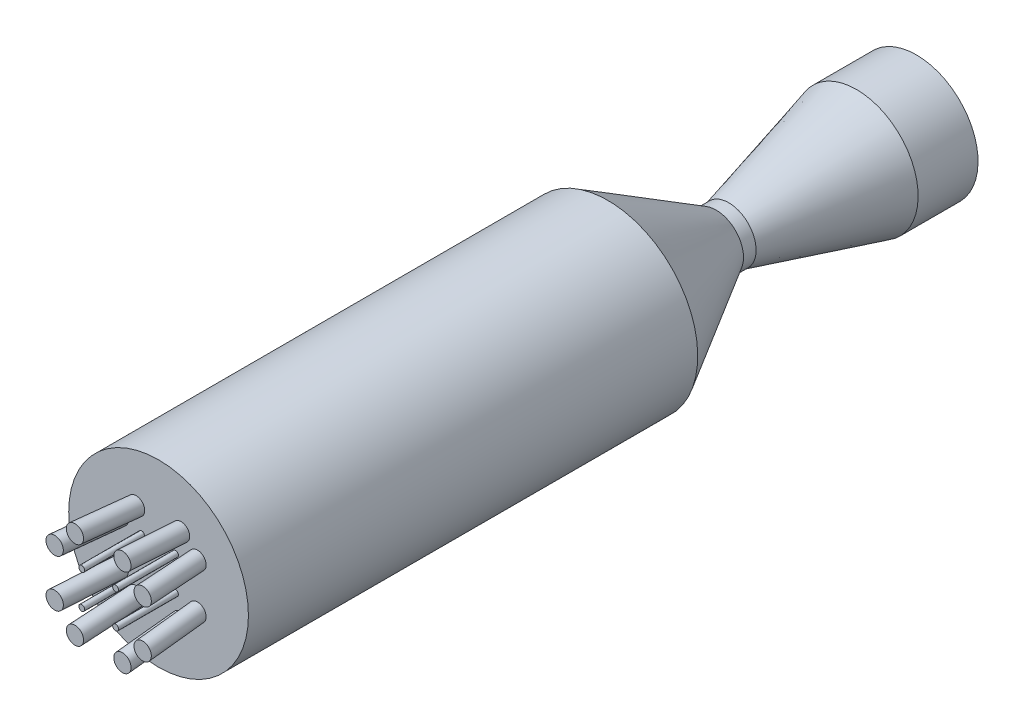
ISO-10303-21;
HEADER;
FILE_DESCRIPTION(('STEP AP214'),'2;1');
FILE_NAME('part.step','',(''),(''),'','','');
FILE_SCHEMA(('AUTOMOTIVE_DESIGN { 1 0 10303 214 1 1 1 1 }'));
ENDSEC;
DATA;
#1=APPLICATION_CONTEXT('core data for automotive mechanical design processes');
#2=APPLICATION_PROTOCOL_DEFINITION('international standard','automotive_design',2000,#1);
#3=PRODUCT_CONTEXT('',#1,'mechanical');
#4=PRODUCT('Part','Part','',(#3));
#5=PRODUCT_RELATED_PRODUCT_CATEGORY('part','',(#4));
#6=PRODUCT_DEFINITION_FORMATION('','',#4);
#7=PRODUCT_DEFINITION_CONTEXT('part definition',#1,'design');
#8=PRODUCT_DEFINITION('design','',#6,#7);
#9=PRODUCT_DEFINITION_SHAPE('','',#8);
#10=(LENGTH_UNIT() NAMED_UNIT(*) SI_UNIT(.MILLI.,.METRE.));
#11=(NAMED_UNIT(*) PLANE_ANGLE_UNIT() SI_UNIT($,.RADIAN.));
#12=(NAMED_UNIT(*) SI_UNIT($,.STERADIAN.) SOLID_ANGLE_UNIT());
#13=UNCERTAINTY_MEASURE_WITH_UNIT(LENGTH_MEASURE(1.E-05),#10,'distance_accuracy_value','');
#14=(GEOMETRIC_REPRESENTATION_CONTEXT(3) GLOBAL_UNCERTAINTY_ASSIGNED_CONTEXT((#13)) GLOBAL_UNIT_ASSIGNED_CONTEXT((#10,
#11,#12)) REPRESENTATION_CONTEXT('',''));
#15=CARTESIAN_POINT('',(0.,0.,0.));
#16=DIRECTION('',(0.,0.,1.));
#17=DIRECTION('',(1.,0.,0.));
#18=AXIS2_PLACEMENT_3D('',#15,#16,#17);
#19=CARTESIAN_POINT('',(0.,0.,-62.6713296347436));
#20=DIRECTION('',(0.,0.,-1.));
#21=DIRECTION('',(0.,1.,0.));
#22=AXIS2_PLACEMENT_3D('',#19,#20,#21);
#23=CONICAL_SURFACE('',#22,4.57,0.261799387799147);
#24=CARTESIAN_POINT('',(0.,0.,-84.));
#25=DIRECTION('',(0.,0.,-1.));
#26=DIRECTION('',(0.,1.,0.));
#27=AXIS2_PLACEMENT_3D('',#24,#25,#26);
#28=CIRCLE('',#27,10.285);
#29=CARTESIAN_POINT('',(0.,10.285,-84.));
#30=VERTEX_POINT('',#29);
#31=EDGE_CURVE('E10',#30,#30,#28,.T.);
#32=ORIENTED_EDGE('',*,*,#31,.F.);
#33=EDGE_LOOP('',(#32));
#34=FACE_BOUND('',#33,.T.);
#35=CARTESIAN_POINT('',(0.,0.,-62.6713296347436));
#36=DIRECTION('',(0.,0.,-1.));
#37=DIRECTION('',(0.,1.,0.));
#38=AXIS2_PLACEMENT_3D('',#35,#36,#37);
#39=CIRCLE('',#38,4.57);
#40=CARTESIAN_POINT('',(0.,4.57,-62.6713296347436));
#41=VERTEX_POINT('',#40);
#42=EDGE_CURVE('E51',#41,#41,#39,.T.);
#43=ORIENTED_EDGE('',*,*,#42,.T.);
#44=EDGE_LOOP('',(#43));
#45=FACE_BOUND('',#44,.T.);
#46=ADVANCED_FACE('F43',(#34,#45),#23,.T.);
#47=CARTESIAN_POINT('',(0.,0.,-62.6713296347436));
#48=DIRECTION('',(0.,0.,-1.));
#49=DIRECTION('',(0.,1.,0.));
#50=AXIS2_PLACEMENT_3D('',#47,#48,#49);
#51=CYLINDRICAL_SURFACE('',#50,4.57);
#52=ORIENTED_EDGE('',*,*,#42,.F.);
#53=EDGE_LOOP('',(#52));
#54=FACE_BOUND('',#53,.T.);
#55=CARTESIAN_POINT('',(0.,0.,-60.5652899229432));
#56=DIRECTION('',(0.,0.,-1.));
#57=DIRECTION('',(0.,1.,0.));
#58=AXIS2_PLACEMENT_3D('',#55,#56,#57);
#59=CIRCLE('',#58,4.57);
#60=CARTESIAN_POINT('',(0.,-4.57,-60.5652899229432));
#61=VERTEX_POINT('',#60);
#62=EDGE_CURVE('E56',#61,#61,#59,.T.);
#63=ORIENTED_EDGE('',*,*,#62,.T.);
#64=EDGE_LOOP('',(#63));
#65=FACE_BOUND('',#64,.T.);
#66=ADVANCED_FACE('F187',(#54,#65),#51,.T.);
#67=CARTESIAN_POINT('',(0.,0.,-42.5));
#68=DIRECTION('',(0.,0.,1.));
#69=DIRECTION('',(0.,-1.,0.));
#70=AXIS2_PLACEMENT_3D('',#67,#68,#69);
#71=CONICAL_SURFACE('',#70,15.,0.523598775598304);
#72=CARTESIAN_POINT('',(0.,0.,-42.5));
#73=DIRECTION('',(0.,0.,-1.));
#74=DIRECTION('',(0.,1.,0.));
#75=AXIS2_PLACEMENT_3D('',#72,#73,#74);
#76=CIRCLE('',#75,15.);
#77=CARTESIAN_POINT('',(0.,-15.,-42.5));
#78=VERTEX_POINT('',#77);
#79=EDGE_CURVE('E61',#78,#78,#76,.T.);
#80=CARTESIAN_POINT('',(0.,-4.57,-60.5652899229432));
#81=CARTESIAN_POINT('',(0.,-4.67864583333333,-60.3771098195792));
#82=CARTESIAN_POINT('',(0.,-4.78729166666667,-60.1889297162152));
#83=CARTESIAN_POINT('',(0.,-5.00458333333334,-59.8125695094872));
#84=CARTESIAN_POINT('',(0.,-5.11322916666667,-59.6243894061232));
#85=CARTESIAN_POINT('',(0.,-5.33052083333333,-59.2480291993952));
#86=CARTESIAN_POINT('',(0.,-5.43916666666667,-59.0598490960313));
#87=CARTESIAN_POINT('',(0.,-5.65645833333333,-58.6834888893033));
#88=CARTESIAN_POINT('',(0.,-5.76510416666667,-58.4953087859393));
#89=CARTESIAN_POINT('',(0.,-5.98239583333333,-58.1189485792113));
#90=CARTESIAN_POINT('',(0.,-6.09104166666667,-57.9307684758473));
#91=CARTESIAN_POINT('',(0.,-6.30833333333333,-57.5544082691193));
#92=CARTESIAN_POINT('',(0.,-6.41697916666667,-57.3662281657553));
#93=CARTESIAN_POINT('',(0.,-6.63427083333333,-56.9898679590273));
#94=CARTESIAN_POINT('',(0.,-6.74291666666667,-56.8016878556634));
#95=CARTESIAN_POINT('',(0.,-6.96020833333333,-56.4253276489354));
#96=CARTESIAN_POINT('',(0.,-7.06885416666667,-56.2371475455714));
#97=CARTESIAN_POINT('',(0.,-7.28614583333333,-55.8607873388434));
#98=CARTESIAN_POINT('',(0.,-7.39479166666667,-55.6726072354794));
#99=CARTESIAN_POINT('',(0.,-7.61208333333333,-55.2962470287514));
#100=CARTESIAN_POINT('',(0.,-7.72072916666667,-55.1080669253874));
#101=CARTESIAN_POINT('',(0.,-7.93802083333333,-54.7317067186594));
#102=CARTESIAN_POINT('',(0.,-8.04666666666666,-54.5435266152955));
#103=CARTESIAN_POINT('',(0.,-8.26395833333333,-54.1671664085675));
#104=CARTESIAN_POINT('',(0.,-8.37260416666667,-53.9789863052035));
#105=CARTESIAN_POINT('',(0.,-8.58989583333333,-53.6026260984755));
#106=CARTESIAN_POINT('',(0.,-8.69854166666667,-53.4144459951115));
#107=CARTESIAN_POINT('',(0.,-8.91583333333333,-53.0380857883835));
#108=CARTESIAN_POINT('',(0.,-9.02447916666667,-52.8499056850195));
#109=CARTESIAN_POINT('',(0.,-9.24177083333333,-52.4735454782915));
#110=CARTESIAN_POINT('',(0.,-9.35041666666667,-52.2853653749276));
#111=CARTESIAN_POINT('',(0.,-9.56770833333333,-51.9090051681996));
#112=CARTESIAN_POINT('',(0.,-9.67635416666666,-51.7208250648356));
#113=CARTESIAN_POINT('',(0.,-9.89364583333333,-51.3444648581076));
#114=CARTESIAN_POINT('',(0.,-10.0022916666667,-51.1562847547436));
#115=CARTESIAN_POINT('',(0.,-10.2195833333333,-50.7799245480156));
#116=CARTESIAN_POINT('',(0.,-10.3282291666667,-50.5917444446516));
#117=CARTESIAN_POINT('',(0.,-10.5455208333333,-50.2153842379237));
#118=CARTESIAN_POINT('',(0.,-10.6541666666667,-50.0272041345597));
#119=CARTESIAN_POINT('',(0.,-10.8714583333333,-49.6508439278317));
#120=CARTESIAN_POINT('',(0.,-10.9801041666667,-49.4626638244677));
#121=CARTESIAN_POINT('',(0.,-11.1973958333333,-49.0863036177397));
#122=CARTESIAN_POINT('',(0.,-11.3060416666667,-48.8981235143757));
#123=CARTESIAN_POINT('',(0.,-11.5233333333333,-48.5217633076477));
#124=CARTESIAN_POINT('',(0.,-11.6319791666667,-48.3335832042837));
#125=CARTESIAN_POINT('',(0.,-11.8492708333333,-47.9572229975558));
#126=CARTESIAN_POINT('',(0.,-11.9579166666667,-47.7690428941918));
#127=CARTESIAN_POINT('',(0.,-12.1752083333333,-47.3926826874638));
#128=CARTESIAN_POINT('',(0.,-12.2838541666667,-47.2045025840998));
#129=CARTESIAN_POINT('',(0.,-12.5011458333333,-46.8281423773718));
#130=CARTESIAN_POINT('',(0.,-12.6097916666667,-46.6399622740078));
#131=CARTESIAN_POINT('',(0.,-12.8270833333333,-46.2636020672798));
#132=CARTESIAN_POINT('',(0.,-12.9357291666667,-46.0754219639158));
#133=CARTESIAN_POINT('',(0.,-13.1530208333333,-45.6990617571879));
#134=CARTESIAN_POINT('',(0.,-13.2616666666667,-45.5108816538239));
#135=CARTESIAN_POINT('',(0.,-13.4789583333333,-45.1345214470959));
#136=CARTESIAN_POINT('',(0.,-13.5876041666667,-44.9463413437319));
#137=CARTESIAN_POINT('',(0.,-13.8048958333333,-44.5699811370039));
#138=CARTESIAN_POINT('',(0.,-13.9135416666667,-44.3818010336399));
#139=CARTESIAN_POINT('',(0.,-14.1308333333333,-44.0054408269119));
#140=CARTESIAN_POINT('',(0.,-14.2394791666667,-43.8172607235479));
#141=CARTESIAN_POINT('',(0.,-14.4567708333333,-43.44090051682));
#142=CARTESIAN_POINT('',(0.,-14.5654166666667,-43.252720413456));
#143=CARTESIAN_POINT('',(0.,-14.7827083333333,-42.876360206728));
#144=CARTESIAN_POINT('',(0.,-14.8913541666667,-42.688180103364));
#145=CARTESIAN_POINT('',(0.,-15.,-42.5));
#146=B_SPLINE_CURVE_WITH_KNOTS('',3,(#80,#81,#82,#83,#84,#85,#86,#87,#88,#89,#90,#91,#92,#93,
#94,#95,#96,#97,#98,#99,#100,#101,#102,#103,#104,#105,#106,#107,#108,#109,#110,#111,#112,#113,
#114,#115,#116,#117,#118,#119,#120,#121,#122,#123,#124,#125,#126,#127,#128,#129,#130,#131,#132,
#133,#134,#135,#136,#137,#138,#139,#140,#141,#142,#143,#144,#145),.UNSPECIFIED.,.F.,.F.,(4,2,2,
2,2,2,2,2,2,2,2,2,2,2,2,2,2,2,2,2,2,2,2,2,2,2,2,2,2,2,2,2,4),(0.,0.651874999999996,
1.30374999999999,1.95562499999999,2.60749999999997,3.25937499999998,3.91124999999997,
4.56312499999996,5.21499999999995,5.86687499999995,6.51874999999994,7.17062499999994,
7.82249999999994,8.47437499999992,9.12624999999992,9.77812499999991,10.4299999999999,
11.0818749999999,11.7337499999999,12.3856249999999,13.0374999999999,13.6893749999999,
14.3412499999999,14.9931249999999,15.6449999999999,16.2968749999999,16.9487499999999,
17.6006249999999,18.2524999999998,18.9043749999998,19.5562499999998,20.2081249999998,
20.8599999999998),.UNSPECIFIED.);
#147=EDGE_CURVE('BSEAM192',#61,#78,#146,.T.);
#148=ORIENTED_EDGE('',*,*,#62,.F.);
#149=ORIENTED_EDGE('',*,*,#79,.T.);
#150=ORIENTED_EDGE('',*,*,#147,.T.);
#151=ORIENTED_EDGE('',*,*,#147,.F.);
#152=EDGE_LOOP('',(#148,#150,#149,#151));
#153=FACE_BOUND('',#152,.T.);
#154=ADVANCED_FACE('F192',(#153),#71,.T.);
#155=CARTESIAN_POINT('',(0.,0.,42.5));
#156=DIRECTION('',(0.,0.,-1.));
#157=DIRECTION('',(-1.,0.,0.));
#158=AXIS2_PLACEMENT_3D('',#155,#156,#157);
#159=CYLINDRICAL_SURFACE('',#158,15.);
#160=ORIENTED_EDGE('',*,*,#79,.F.);
#161=EDGE_LOOP('',(#160));
#162=FACE_BOUND('',#161,.T.);
#163=CARTESIAN_POINT('',(0.,0.,32.5));
#164=DIRECTION('',(0.,0.,1.));
#165=DIRECTION('',(1.,0.,0.));
#166=AXIS2_PLACEMENT_3D('',#163,#164,#165);
#167=CIRCLE('',#166,15.);
#168=CARTESIAN_POINT('',(15.,0.,32.5));
#169=VERTEX_POINT('',#168);
#170=EDGE_CURVE('E67',#169,#169,#167,.T.);
#171=ORIENTED_EDGE('',*,*,#170,.F.);
#172=EDGE_LOOP('',(#171));
#173=FACE_BOUND('',#172,.T.);
#174=ADVANCED_FACE('F198',(#162,#173),#159,.T.);
#175=CARTESIAN_POINT('',(-7.41821043677447,-3.98198390985581,43.3782773972939));
#176=DIRECTION('',(0.0845269435031215,0.0212442772509707,-0.996194698091745));
#177=DIRECTION('',(-0.996419575167966,0.,-0.084546024283167));
#178=AXIS2_PLACEMENT_3D('',#175,#176,#177);
#179=CYLINDRICAL_SURFACE('',#178,1.44135);
#180=CARTESIAN_POINT('',(-7.34368875533675,-3.96325426938783,42.5));
#181=DIRECTION('',(0.,0.,1.));
#182=DIRECTION('',(0.96983791128775,0.243750745289145,0.));
#183=AXIS2_PLACEMENT_3D('',#180,#181,#182);
#184=ELLIPSE('',#183,1.4468557228431,1.44135);
#185=CARTESIAN_POINT('',(-5.94047322315987,-3.61058210861895,42.5));
#186=VERTEX_POINT('',#185);
#187=EDGE_CURVE('E72',#186,#186,#184,.F.);
#188=ORIENTED_EDGE('',*,*,#187,.T.);
#189=EDGE_LOOP('',(#188));
#190=FACE_BOUND('',#189,.T.);
#191=CARTESIAN_POINT('',(-6.49519052838336,-3.74999999999987,32.5));
#192=DIRECTION('',(0.,0.,1.));
#193=DIRECTION('',(0.96983791128775,0.243750745289145,0.));
#194=AXIS2_PLACEMENT_3D('',#191,#192,#193);
#195=ELLIPSE('',#194,1.4468557228431,1.44135);
#196=CARTESIAN_POINT('',(-5.09197499620648,-3.397327839231,32.5));
#197=VERTEX_POINT('',#196);
#198=EDGE_CURVE('E68',#197,#197,#195,.F.);
#199=ORIENTED_EDGE('',*,*,#198,.F.);
#200=EDGE_LOOP('',(#199));
#201=FACE_BOUND('',#200,.T.);
#202=ADVANCED_FACE('F248',(#190,#201),#179,.T.);
#203=CARTESIAN_POINT('',(3.98198390985589,-7.41821043677443,43.3782773972939));
#204=DIRECTION('',(-0.0212442772509716,0.0845269435031213,-0.996194698091746));
#205=DIRECTION('',(0.,0.996419575167966,0.0845460242831668));
#206=AXIS2_PLACEMENT_3D('',#203,#204,#205);
#207=CYLINDRICAL_SURFACE('',#206,1.44135);
#208=CARTESIAN_POINT('',(3.9632542693879,-7.34368875533671,42.5));
#209=DIRECTION('',(0.,0.,1.));
#210=DIRECTION('',(-0.243750745289155,0.969837911287748,0.));
#211=AXIS2_PLACEMENT_3D('',#208,#209,#210);
#212=ELLIPSE('',#211,1.4468557228431,1.44135);
#213=CARTESIAN_POINT('',(3.61058210861902,-5.94047322315983,42.5));
#214=VERTEX_POINT('',#213);
#215=EDGE_CURVE('E78',#214,#214,#212,.F.);
#216=ORIENTED_EDGE('',*,*,#215,.T.);
#217=EDGE_LOOP('',(#216));
#218=FACE_BOUND('',#217,.T.);
#219=CARTESIAN_POINT('',(3.74999999999994,-6.49519052838332,32.5));
#220=DIRECTION('',(0.,0.,1.));
#221=DIRECTION('',(-0.243750745289155,0.969837911287748,0.));
#222=AXIS2_PLACEMENT_3D('',#219,#220,#221);
#223=ELLIPSE('',#222,1.4468557228431,1.44135);
#224=CARTESIAN_POINT('',(3.39732783923106,-5.09197499620644,32.5));
#225=VERTEX_POINT('',#224);
#226=EDGE_CURVE('E74',#225,#225,#223,.F.);
#227=ORIENTED_EDGE('',*,*,#226,.F.);
#228=EDGE_LOOP('',(#227));
#229=FACE_BOUND('',#228,.T.);
#230=ADVANCED_FACE('F244',(#218,#229),#207,.T.);
#231=CARTESIAN_POINT('',(7.41821043677444,3.98198390985586,43.3782773972939));
#232=DIRECTION('',(-0.0845269435031213,-0.0212442772509713,-0.996194698091746));
#233=DIRECTION('',(-0.996419575167966,0.,0.0845460242831669));
#234=AXIS2_PLACEMENT_3D('',#231,#232,#233);
#235=CYLINDRICAL_SURFACE('',#234,1.44135);
#236=CARTESIAN_POINT('',(7.34368875533673,3.96325426938788,42.5));
#237=DIRECTION('',(0.,0.,1.));
#238=DIRECTION('',(-0.969837911287749,-0.243750745289152,0.));
#239=AXIS2_PLACEMENT_3D('',#236,#237,#238);
#240=ELLIPSE('',#239,1.4468557228431,1.44135);
#241=CARTESIAN_POINT('',(5.94047322315984,3.610582108619,42.5));
#242=VERTEX_POINT('',#241);
#243=EDGE_CURVE('E83',#242,#242,#240,.F.);
#244=ORIENTED_EDGE('',*,*,#243,.T.);
#245=EDGE_LOOP('',(#244));
#246=FACE_BOUND('',#245,.T.);
#247=CARTESIAN_POINT('',(6.49519052838334,3.74999999999992,32.5));
#248=DIRECTION('',(0.,0.,1.));
#249=DIRECTION('',(-0.969837911287749,-0.243750745289152,0.));
#250=AXIS2_PLACEMENT_3D('',#247,#248,#249);
#251=ELLIPSE('',#250,1.4468557228431,1.44135);
#252=CARTESIAN_POINT('',(5.09197499620645,3.39732783923104,32.5));
#253=VERTEX_POINT('',#252);
#254=EDGE_CURVE('E79',#253,#253,#251,.F.);
#255=ORIENTED_EDGE('',*,*,#254,.F.);
#256=EDGE_LOOP('',(#255));
#257=FACE_BOUND('',#256,.T.);
#258=ADVANCED_FACE('F240',(#246,#257),#235,.T.);
#259=CARTESIAN_POINT('',(3.98198390985599,7.41821043677437,43.3782773972939));
#260=DIRECTION('',(-0.0212442772509728,-0.084526943503121,-0.996194698091745));
#261=DIRECTION('',(0.,0.996419575167966,-0.0845460242831665));
#262=AXIS2_PLACEMENT_3D('',#259,#260,#261);
#263=CYLINDRICAL_SURFACE('',#262,1.44135);
#264=CARTESIAN_POINT('',(3.96325426938801,7.34368875533666,42.5));
#265=DIRECTION('',(0.,0.,1.));
#266=DIRECTION('',(-0.243750745289169,-0.969837911287745,0.));
#267=AXIS2_PLACEMENT_3D('',#264,#265,#266);
#268=ELLIPSE('',#267,1.4468557228431,1.44135);
#269=CARTESIAN_POINT('',(3.6105821086191,5.94047322315978,42.5));
#270=VERTEX_POINT('',#269);
#271=EDGE_CURVE('E88',#270,#270,#268,.T.);
#272=ORIENTED_EDGE('',*,*,#271,.F.);
#273=EDGE_LOOP('',(#272));
#274=FACE_BOUND('',#273,.T.);
#275=CARTESIAN_POINT('',(3.75000000000003,6.49519052838327,32.5));
#276=DIRECTION('',(0.,0.,1.));
#277=DIRECTION('',(-0.243750745289169,-0.969837911287745,0.));
#278=AXIS2_PLACEMENT_3D('',#275,#276,#277);
#279=ELLIPSE('',#278,1.4468557228431,1.44135);
#280=CARTESIAN_POINT('',(3.39732783923113,5.09197499620639,32.5));
#281=VERTEX_POINT('',#280);
#282=EDGE_CURVE('E84',#281,#281,#279,.T.);
#283=ORIENTED_EDGE('',*,*,#282,.T.);
#284=EDGE_LOOP('',(#283));
#285=FACE_BOUND('',#284,.T.);
#286=ADVANCED_FACE('F236',(#274,#285),#263,.T.);
#287=CARTESIAN_POINT('',(7.41821043677438,-3.98198390985597,43.3782773972939));
#288=DIRECTION('',(-0.084526943503121,0.0212442772509725,-0.996194698091745));
#289=DIRECTION('',(-0.996419575167966,0.,0.0845460242831666));
#290=AXIS2_PLACEMENT_3D('',#287,#288,#289);
#291=CYLINDRICAL_SURFACE('',#290,1.44135);
#292=CARTESIAN_POINT('',(7.34368875533667,-3.96325426938798,42.5));
#293=DIRECTION('',(0.,0.,1.));
#294=DIRECTION('',(-0.969837911287745,0.243750745289165,0.));
#295=AXIS2_PLACEMENT_3D('',#292,#293,#294);
#296=ELLIPSE('',#295,1.4468557228431,1.44135);
#297=CARTESIAN_POINT('',(5.94047322315979,-3.61058210861908,42.5));
#298=VERTEX_POINT('',#297);
#299=EDGE_CURVE('E89',#298,#298,#296,.T.);
#300=ORIENTED_EDGE('',*,*,#299,.F.);
#301=EDGE_LOOP('',(#300));
#302=FACE_BOUND('',#301,.T.);
#303=CARTESIAN_POINT('',(6.49519052838328,-3.75000000000001,32.5));
#304=DIRECTION('',(0.,0.,1.));
#305=DIRECTION('',(-0.969837911287745,0.243750745289165,0.));
#306=AXIS2_PLACEMENT_3D('',#303,#304,#305);
#307=ELLIPSE('',#306,1.4468557228431,1.44135);
#308=CARTESIAN_POINT('',(5.09197499620641,-3.39732783923111,32.5));
#309=VERTEX_POINT('',#308);
#310=EDGE_CURVE('E90',#309,#309,#307,.T.);
#311=ORIENTED_EDGE('',*,*,#310,.T.);
#312=EDGE_LOOP('',(#311));
#313=FACE_BOUND('',#312,.T.);
#314=ADVANCED_FACE('F232',(#302,#313),#291,.T.);
#315=CARTESIAN_POINT('',(-3.98198390985605,-7.41821043677434,43.3782773972939));
#316=DIRECTION('',(0.0212442772509734,0.0845269435031208,-0.996194698091746));
#317=DIRECTION('',(0.,0.996419575167966,0.0845460242831664));
#318=AXIS2_PLACEMENT_3D('',#315,#316,#317);
#319=CYLINDRICAL_SURFACE('',#318,1.44135);
#320=CARTESIAN_POINT('',(-3.96325426938806,-7.34368875533663,42.5));
#321=DIRECTION('',(0.,0.,1.));
#322=DIRECTION('',(0.243750745289175,0.969837911287743,0.));
#323=AXIS2_PLACEMENT_3D('',#320,#321,#322);
#324=ELLIPSE('',#323,1.4468557228431,1.44135);
#325=CARTESIAN_POINT('',(-3.61058210861914,-5.94047322315976,42.5));
#326=VERTEX_POINT('',#325);
#327=EDGE_CURVE('E94',#326,#326,#324,.T.);
#328=ORIENTED_EDGE('',*,*,#327,.F.);
#329=EDGE_LOOP('',(#328));
#330=FACE_BOUND('',#329,.T.);
#331=CARTESIAN_POINT('',(-3.75000000000008,-6.49519052838325,32.5));
#332=DIRECTION('',(0.,0.,1.));
#333=DIRECTION('',(0.243750745289175,0.969837911287743,0.));
#334=AXIS2_PLACEMENT_3D('',#331,#332,#333);
#335=ELLIPSE('',#334,1.4468557228431,1.44135);
#336=CARTESIAN_POINT('',(-3.39732783923116,-5.09197499620637,32.5));
#337=VERTEX_POINT('',#336);
#338=EDGE_CURVE('E95',#337,#337,#335,.T.);
#339=ORIENTED_EDGE('',*,*,#338,.T.);
#340=EDGE_LOOP('',(#339));
#341=FACE_BOUND('',#340,.T.);
#342=ADVANCED_FACE('F228',(#330,#341),#319,.T.);
#343=CARTESIAN_POINT('',(-3.98198390985589,7.41821043677443,43.3782773972939));
#344=DIRECTION('',(0.0212442772509716,-0.0845269435031213,-0.996194698091746));
#345=DIRECTION('',(0.,0.996419575167966,-0.0845460242831668));
#346=AXIS2_PLACEMENT_3D('',#343,#344,#345);
#347=CYLINDRICAL_SURFACE('',#346,1.44135);
#348=CARTESIAN_POINT('',(-3.9632542693879,7.34368875533671,42.5));
#349=DIRECTION('',(0.,0.,1.));
#350=DIRECTION('',(0.243750745289155,-0.969837911287748,0.));
#351=AXIS2_PLACEMENT_3D('',#348,#349,#350);
#352=ELLIPSE('',#351,1.4468557228431,1.44135);
#353=CARTESIAN_POINT('',(-3.61058210861902,5.94047322315983,42.5));
#354=VERTEX_POINT('',#353);
#355=EDGE_CURVE('E103',#354,#354,#352,.F.);
#356=ORIENTED_EDGE('',*,*,#355,.T.);
#357=EDGE_LOOP('',(#356));
#358=FACE_BOUND('',#357,.T.);
#359=CARTESIAN_POINT('',(-3.74999999999994,6.49519052838332,32.5));
#360=DIRECTION('',(0.,0.,1.));
#361=DIRECTION('',(0.243750745289155,-0.969837911287748,0.));
#362=AXIS2_PLACEMENT_3D('',#359,#360,#361);
#363=ELLIPSE('',#362,1.4468557228431,1.44135);
#364=CARTESIAN_POINT('',(-3.39732783923106,5.09197499620644,32.5));
#365=VERTEX_POINT('',#364);
#366=EDGE_CURVE('E99',#365,#365,#363,.F.);
#367=ORIENTED_EDGE('',*,*,#366,.F.);
#368=EDGE_LOOP('',(#367));
#369=FACE_BOUND('',#368,.T.);
#370=ADVANCED_FACE('F224',(#358,#369),#347,.T.);
#371=CARTESIAN_POINT('',(-7.41821043677438,3.98198390985597,43.3782773972939));
#372=DIRECTION('',(0.084526943503121,-0.0212442772509725,-0.996194698091745));
#373=DIRECTION('',(-0.996419575167966,0.,-0.0845460242831666));
#374=AXIS2_PLACEMENT_3D('',#371,#372,#373);
#375=CYLINDRICAL_SURFACE('',#374,1.44135);
#376=CARTESIAN_POINT('',(-7.34368875533667,3.96325426938798,42.5));
#377=DIRECTION('',(0.,0.,1.));
#378=DIRECTION('',(0.969837911287745,-0.243750745289165,0.));
#379=AXIS2_PLACEMENT_3D('',#376,#377,#378);
#380=ELLIPSE('',#379,1.4468557228431,1.44135);
#381=CARTESIAN_POINT('',(-5.94047322315979,3.61058210861908,42.5));
#382=VERTEX_POINT('',#381);
#383=EDGE_CURVE('E108',#382,#382,#380,.T.);
#384=ORIENTED_EDGE('',*,*,#383,.F.);
#385=EDGE_LOOP('',(#384));
#386=FACE_BOUND('',#385,.T.);
#387=CARTESIAN_POINT('',(-6.49519052838328,3.75000000000001,32.5));
#388=DIRECTION('',(0.,0.,1.));
#389=DIRECTION('',(0.969837911287745,-0.243750745289165,0.));
#390=AXIS2_PLACEMENT_3D('',#387,#388,#389);
#391=ELLIPSE('',#390,1.4468557228431,1.44135);
#392=CARTESIAN_POINT('',(-5.09197499620641,3.39732783923111,32.5));
#393=VERTEX_POINT('',#392);
#394=EDGE_CURVE('E104',#393,#393,#391,.T.);
#395=ORIENTED_EDGE('',*,*,#394,.T.);
#396=EDGE_LOOP('',(#395));
#397=FACE_BOUND('',#396,.T.);
#398=ADVANCED_FACE('F220',(#386,#397),#375,.T.);
#399=CARTESIAN_POINT('',(2.82842712474619,-2.82842712474619,32.5));
#400=DIRECTION('',(0.,0.,1.));
#401=DIRECTION('',(1.,0.,0.));
#402=AXIS2_PLACEMENT_3D('',#399,#400,#401);
#403=CYLINDRICAL_SURFACE('',#402,0.484915);
#404=CARTESIAN_POINT('',(2.82842712474619,-2.82842712474619,32.5));
#405=DIRECTION('',(0.,0.,1.));
#406=DIRECTION('',(0.,-1.,0.));
#407=AXIS2_PLACEMENT_3D('',#404,#405,#406);
#408=CIRCLE('',#407,0.484915);
#409=CARTESIAN_POINT('',(2.82842712474618,-3.31334212474619,32.5));
#410=VERTEX_POINT('',#409);
#411=EDGE_CURVE('E117',#410,#410,#408,.T.);
#412=ORIENTED_EDGE('',*,*,#411,.T.);
#413=EDGE_LOOP('',(#412));
#414=FACE_BOUND('',#413,.T.);
#415=CARTESIAN_POINT('',(2.82842712474619,-2.82842712474619,42.5));
#416=DIRECTION('',(0.,0.,1.));
#417=DIRECTION('',(0.,-1.,0.));
#418=AXIS2_PLACEMENT_3D('',#415,#416,#417);
#419=CIRCLE('',#418,0.484915);
#420=CARTESIAN_POINT('',(2.82842712474618,-3.31334212474619,42.5));
#421=VERTEX_POINT('',#420);
#422=EDGE_CURVE('E137',#421,#421,#419,.T.);
#423=ORIENTED_EDGE('',*,*,#422,.F.);
#424=EDGE_LOOP('',(#423));
#425=FACE_BOUND('',#424,.T.);
#426=ADVANCED_FACE('F216',(#414,#425),#403,.T.);
#427=CARTESIAN_POINT('',(-2.82842712474618,-2.8284271247462,32.5));
#428=DIRECTION('',(0.,0.,1.));
#429=DIRECTION('',(1.,0.,0.));
#430=AXIS2_PLACEMENT_3D('',#427,#428,#429);
#431=CYLINDRICAL_SURFACE('',#430,0.484915);
#432=CARTESIAN_POINT('',(-2.82842712474618,-2.8284271247462,32.5));
#433=DIRECTION('',(0.,0.,1.));
#434=DIRECTION('',(-1.,0.,0.));
#435=AXIS2_PLACEMENT_3D('',#432,#433,#434);
#436=CIRCLE('',#435,0.484915);
#437=CARTESIAN_POINT('',(-3.31334212474618,-2.8284271247462,32.5));
#438=VERTEX_POINT('',#437);
#439=EDGE_CURVE('E133',#438,#438,#436,.T.);
#440=ORIENTED_EDGE('',*,*,#439,.T.);
#441=EDGE_LOOP('',(#440));
#442=FACE_BOUND('',#441,.T.);
#443=CARTESIAN_POINT('',(-2.82842712474618,-2.8284271247462,42.5));
#444=DIRECTION('',(0.,0.,1.));
#445=DIRECTION('',(-1.,0.,0.));
#446=AXIS2_PLACEMENT_3D('',#443,#444,#445);
#447=CIRCLE('',#446,0.484915);
#448=CARTESIAN_POINT('',(-3.31334212474618,-2.8284271247462,42.5));
#449=VERTEX_POINT('',#448);
#450=EDGE_CURVE('E129',#449,#449,#447,.T.);
#451=ORIENTED_EDGE('',*,*,#450,.F.);
#452=EDGE_LOOP('',(#451));
#453=FACE_BOUND('',#452,.T.);
#454=ADVANCED_FACE('F212',(#442,#453),#431,.T.);
#455=CARTESIAN_POINT('',(-2.82842712474617,2.82842712474621,32.5));
#456=DIRECTION('',(0.,0.,1.));
#457=DIRECTION('',(1.,0.,0.));
#458=AXIS2_PLACEMENT_3D('',#455,#456,#457);
#459=CYLINDRICAL_SURFACE('',#458,0.484915);
#460=CARTESIAN_POINT('',(-2.82842712474617,2.82842712474621,32.5));
#461=DIRECTION('',(0.,0.,1.));
#462=DIRECTION('',(0.,1.,0.));
#463=AXIS2_PLACEMENT_3D('',#460,#461,#462);
#464=CIRCLE('',#463,0.484915);
#465=CARTESIAN_POINT('',(-2.82842712474616,3.31334212474621,32.5));
#466=VERTEX_POINT('',#465);
#467=EDGE_CURVE('E125',#466,#466,#464,.T.);
#468=ORIENTED_EDGE('',*,*,#467,.T.);
#469=EDGE_LOOP('',(#468));
#470=FACE_BOUND('',#469,.T.);
#471=CARTESIAN_POINT('',(-2.82842712474617,2.82842712474621,42.5));
#472=DIRECTION('',(0.,0.,1.));
#473=DIRECTION('',(0.,1.,0.));
#474=AXIS2_PLACEMENT_3D('',#471,#472,#473);
#475=CIRCLE('',#474,0.484915);
#476=CARTESIAN_POINT('',(-2.82842712474616,3.31334212474621,42.5));
#477=VERTEX_POINT('',#476);
#478=EDGE_CURVE('E121',#477,#477,#475,.T.);
#479=ORIENTED_EDGE('',*,*,#478,.F.);
#480=EDGE_LOOP('',(#479));
#481=FACE_BOUND('',#480,.T.);
#482=ADVANCED_FACE('F208',(#470,#481),#459,.T.);
#483=CARTESIAN_POINT('',(2.82842712474618,2.8284271247462,32.5));
#484=DIRECTION('',(0.,0.,1.));
#485=DIRECTION('',(1.,0.,0.));
#486=AXIS2_PLACEMENT_3D('',#483,#484,#485);
#487=CYLINDRICAL_SURFACE('',#486,0.484915);
#488=CARTESIAN_POINT('',(2.82842712474618,2.8284271247462,32.5));
#489=DIRECTION('',(0.,0.,1.));
#490=DIRECTION('',(1.,0.,0.));
#491=AXIS2_PLACEMENT_3D('',#488,#489,#490);
#492=CIRCLE('',#491,0.484915);
#493=CARTESIAN_POINT('',(3.31334212474618,2.8284271247462,32.5));
#494=VERTEX_POINT('',#493);
#495=EDGE_CURVE('E112',#494,#494,#492,.T.);
#496=ORIENTED_EDGE('',*,*,#495,.T.);
#497=EDGE_LOOP('',(#496));
#498=FACE_BOUND('',#497,.T.);
#499=CARTESIAN_POINT('',(2.82842712474618,2.8284271247462,42.5));
#500=DIRECTION('',(0.,0.,1.));
#501=DIRECTION('',(1.,0.,0.));
#502=AXIS2_PLACEMENT_3D('',#499,#500,#501);
#503=CIRCLE('',#502,0.484915);
#504=CARTESIAN_POINT('',(3.31334212474618,2.8284271247462,42.5));
#505=VERTEX_POINT('',#504);
#506=EDGE_CURVE('E113',#505,#505,#503,.T.);
#507=ORIENTED_EDGE('',*,*,#506,.F.);
#508=EDGE_LOOP('',(#507));
#509=FACE_BOUND('',#508,.T.);
#510=ADVANCED_FACE('F204',(#498,#509),#487,.T.);
#511=CARTESIAN_POINT('',(0.,0.,32.5));
#512=DIRECTION('',(0.,0.,1.));
#513=DIRECTION('',(1.,0.,0.));
#514=AXIS2_PLACEMENT_3D('',#511,#512,#513);
#515=PLANE('',#514);
#516=ORIENTED_EDGE('',*,*,#198,.T.);
#517=EDGE_LOOP('',(#516));
#518=FACE_BOUND('',#517,.T.);
#519=ORIENTED_EDGE('',*,*,#226,.T.);
#520=EDGE_LOOP('',(#519));
#521=FACE_BOUND('',#520,.T.);
#522=ORIENTED_EDGE('',*,*,#254,.T.);
#523=EDGE_LOOP('',(#522));
#524=FACE_BOUND('',#523,.T.);
#525=ORIENTED_EDGE('',*,*,#282,.F.);
#526=EDGE_LOOP('',(#525));
#527=FACE_BOUND('',#526,.T.);
#528=ORIENTED_EDGE('',*,*,#310,.F.);
#529=EDGE_LOOP('',(#528));
#530=FACE_BOUND('',#529,.T.);
#531=ORIENTED_EDGE('',*,*,#338,.F.);
#532=EDGE_LOOP('',(#531));
#533=FACE_BOUND('',#532,.T.);
#534=ORIENTED_EDGE('',*,*,#366,.T.);
#535=EDGE_LOOP('',(#534));
#536=FACE_BOUND('',#535,.T.);
#537=ORIENTED_EDGE('',*,*,#394,.F.);
#538=EDGE_LOOP('',(#537));
#539=FACE_BOUND('',#538,.T.);
#540=ORIENTED_EDGE('',*,*,#411,.F.);
#541=EDGE_LOOP('',(#540));
#542=FACE_BOUND('',#541,.T.);
#543=ORIENTED_EDGE('',*,*,#439,.F.);
#544=EDGE_LOOP('',(#543));
#545=FACE_BOUND('',#544,.T.);
#546=ORIENTED_EDGE('',*,*,#467,.F.);
#547=EDGE_LOOP('',(#546));
#548=FACE_BOUND('',#547,.T.);
#549=ORIENTED_EDGE('',*,*,#495,.F.);
#550=EDGE_LOOP('',(#549));
#551=FACE_BOUND('',#550,.T.);
#552=ORIENTED_EDGE('',*,*,#170,.T.);
#553=EDGE_LOOP('',(#552));
#554=FACE_BOUND('',#553,.T.);
#555=ADVANCED_FACE('F200',(#518,#521,#524,#527,#530,#533,#536,#539,#542,#545,#548,#551,#554),
#515,.T.);
#556=CARTESIAN_POINT('',(0.,0.,42.5));
#557=DIRECTION('',(0.,0.,1.));
#558=DIRECTION('',(1.,0.,0.));
#559=AXIS2_PLACEMENT_3D('',#556,#557,#558);
#560=PLANE('',#559);
#561=ORIENTED_EDGE('',*,*,#506,.T.);
#562=EDGE_LOOP('',(#561));
#563=FACE_BOUND('',#562,.T.);
#564=ADVANCED_FACE('F203',(#563),#560,.T.);
#565=ORIENTED_EDGE('',*,*,#478,.T.);
#566=EDGE_LOOP('',(#565));
#567=FACE_BOUND('',#566,.T.);
#568=ADVANCED_FACE('F321',(#567),#560,.T.);
#569=ORIENTED_EDGE('',*,*,#450,.T.);
#570=EDGE_LOOP('',(#569));
#571=FACE_BOUND('',#570,.T.);
#572=ADVANCED_FACE('F328',(#571),#560,.T.);
#573=ORIENTED_EDGE('',*,*,#422,.T.);
#574=EDGE_LOOP('',(#573));
#575=FACE_BOUND('',#574,.T.);
#576=ADVANCED_FACE('F335',(#575),#560,.T.);
#577=ORIENTED_EDGE('',*,*,#383,.T.);
#578=EDGE_LOOP('',(#577));
#579=FACE_BOUND('',#578,.T.);
#580=ADVANCED_FACE('F342',(#579),#560,.T.);
#581=ORIENTED_EDGE('',*,*,#355,.F.);
#582=EDGE_LOOP('',(#581));
#583=FACE_BOUND('',#582,.T.);
#584=ADVANCED_FACE('F45',(#583),#560,.T.);
#585=ORIENTED_EDGE('',*,*,#327,.T.);
#586=EDGE_LOOP('',(#585));
#587=FACE_BOUND('',#586,.T.);
#588=ADVANCED_FACE('F356',(#587),#560,.T.);
#589=ORIENTED_EDGE('',*,*,#299,.T.);
#590=EDGE_LOOP('',(#589));
#591=FACE_BOUND('',#590,.T.);
#592=ADVANCED_FACE('F363',(#591),#560,.T.);
#593=ORIENTED_EDGE('',*,*,#271,.T.);
#594=EDGE_LOOP('',(#593));
#595=FACE_BOUND('',#594,.T.);
#596=ADVANCED_FACE('F370',(#595),#560,.T.);
#597=ORIENTED_EDGE('',*,*,#243,.F.);
#598=EDGE_LOOP('',(#597));
#599=FACE_BOUND('',#598,.T.);
#600=ADVANCED_FACE('F350',(#599),#560,.T.);
#601=ORIENTED_EDGE('',*,*,#215,.F.);
#602=EDGE_LOOP('',(#601));
#603=FACE_BOUND('',#602,.T.);
#604=ADVANCED_FACE('F183',(#603),#560,.T.);
#605=ORIENTED_EDGE('',*,*,#187,.F.);
#606=EDGE_LOOP('',(#605));
#607=FACE_BOUND('',#606,.T.);
#608=ADVANCED_FACE('F176',(#607),#560,.T.);
#609=CARTESIAN_POINT('',(0.,0.,-94.));
#610=DIRECTION('',(0.,0.,1.));
#611=DIRECTION('',(0.,-1.,0.));
#612=AXIS2_PLACEMENT_3D('',#609,#610,#611);
#613=CYLINDRICAL_SURFACE('',#612,10.285);
#614=CARTESIAN_POINT('',(0.,0.,-94.));
#615=DIRECTION('',(0.,0.,-1.));
#616=DIRECTION('',(0.,1.,0.));
#617=AXIS2_PLACEMENT_3D('',#614,#615,#616);
#618=CIRCLE('',#617,10.285);
#619=CARTESIAN_POINT('',(0.,10.285,-94.));
#620=VERTEX_POINT('',#619);
#621=EDGE_CURVE('E73',#620,#620,#618,.T.);
#622=ORIENTED_EDGE('',*,*,#621,.F.);
#623=EDGE_LOOP('',(#622));
#624=FACE_BOUND('',#623,.T.);
#625=ORIENTED_EDGE('',*,*,#31,.T.);
#626=EDGE_LOOP('',(#625));
#627=FACE_BOUND('',#626,.T.);
#628=ADVANCED_FACE('F174',(#624,#627),#613,.T.);
#629=CARTESIAN_POINT('',(0.,0.,-94.));
#630=DIRECTION('',(0.,0.,-1.));
#631=DIRECTION('',(0.,1.,0.));
#632=AXIS2_PLACEMENT_3D('',#629,#630,#631);
#633=PLANE('',#632);
#634=ORIENTED_EDGE('',*,*,#621,.T.);
#635=EDGE_LOOP('',(#634));
#636=FACE_BOUND('',#635,.T.);
#637=ADVANCED_FACE('F172',(#636),#633,.T.);
#638=CLOSED_SHELL('',(#46,#66,#154,#174,#202,#230,#258,#286,#314,#342,#370,#398,#426,#454,#482,
#510,#555,#564,#568,#572,#576,#580,#584,#588,#592,#596,#600,#604,#608,#628,#637));
#639=MANIFOLD_SOLID_BREP('B2',#638);
#640=ADVANCED_BREP_SHAPE_REPRESENTATION('',(#18,#639),#14);
#641=SHAPE_DEFINITION_REPRESENTATION(#9,#640);
ENDSEC;
END-ISO-10303-21;
